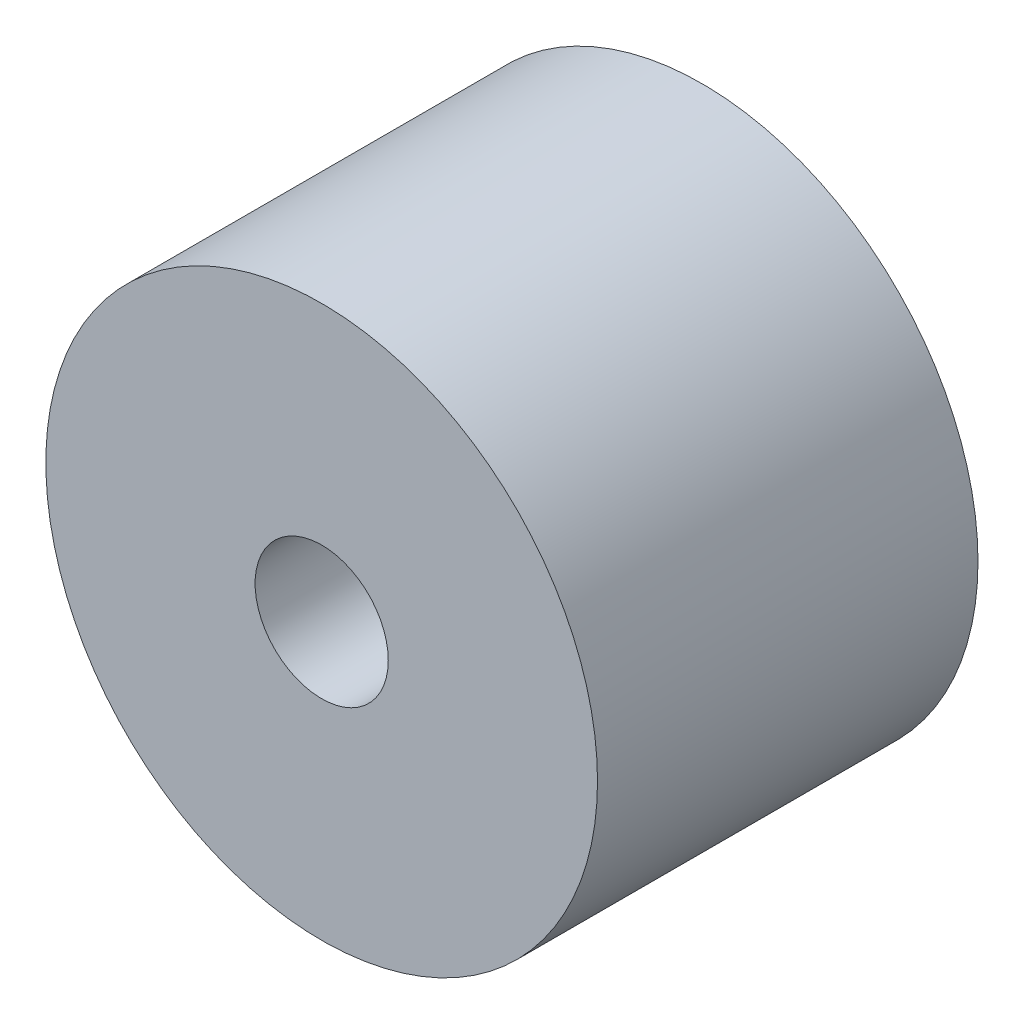
ISO-10303-21;
HEADER;
FILE_DESCRIPTION(('STEP AP214'),'2;1');
FILE_NAME('part.step','',(''),(''),'','','');
FILE_SCHEMA(('AUTOMOTIVE_DESIGN { 1 0 10303 214 1 1 1 1 }'));
ENDSEC;
DATA;
#1=APPLICATION_CONTEXT('core data for automotive mechanical design processes');
#2=APPLICATION_PROTOCOL_DEFINITION('international standard','automotive_design',2000,#1);
#3=PRODUCT_CONTEXT('',#1,'mechanical');
#4=PRODUCT('Part','Part','',(#3));
#5=PRODUCT_RELATED_PRODUCT_CATEGORY('part','',(#4));
#6=PRODUCT_DEFINITION_FORMATION('','',#4);
#7=PRODUCT_DEFINITION_CONTEXT('part definition',#1,'design');
#8=PRODUCT_DEFINITION('design','',#6,#7);
#9=PRODUCT_DEFINITION_SHAPE('','',#8);
#10=(LENGTH_UNIT() NAMED_UNIT(*) SI_UNIT(.MILLI.,.METRE.));
#11=(NAMED_UNIT(*) PLANE_ANGLE_UNIT() SI_UNIT($,.RADIAN.));
#12=(NAMED_UNIT(*) SI_UNIT($,.STERADIAN.) SOLID_ANGLE_UNIT());
#13=UNCERTAINTY_MEASURE_WITH_UNIT(LENGTH_MEASURE(1.E-05),#10,'distance_accuracy_value','');
#14=(GEOMETRIC_REPRESENTATION_CONTEXT(3) GLOBAL_UNCERTAINTY_ASSIGNED_CONTEXT((#13)) GLOBAL_UNIT_ASSIGNED_CONTEXT((#10,
#11,#12)) REPRESENTATION_CONTEXT('',''));
#15=CARTESIAN_POINT('',(0.,0.,0.));
#16=DIRECTION('',(0.,0.,1.));
#17=DIRECTION('',(1.,0.,0.));
#18=AXIS2_PLACEMENT_3D('',#15,#16,#17);
#19=CARTESIAN_POINT('',(0.,0.,20.));
#20=DIRECTION('',(0.,0.,1.));
#21=DIRECTION('',(1.,0.,0.));
#22=AXIS2_PLACEMENT_3D('',#19,#20,#21);
#23=PLANE('',#22);
#24=CARTESIAN_POINT('',(0.,0.,20.));
#25=DIRECTION('',(0.,0.,1.));
#26=DIRECTION('',(1.,0.,0.));
#27=AXIS2_PLACEMENT_3D('',#24,#25,#26);
#28=CIRCLE('',#27,14.5);
#29=CARTESIAN_POINT('',(14.5,0.,20.));
#30=VERTEX_POINT('',#29);
#31=EDGE_CURVE('E10',#30,#30,#28,.T.);
#32=ORIENTED_EDGE('',*,*,#31,.T.);
#33=EDGE_LOOP('',(#32));
#34=FACE_BOUND('',#33,.T.);
#35=CARTESIAN_POINT('',(0.,0.,20.));
#36=DIRECTION('',(0.,0.,1.));
#37=DIRECTION('',(1.,0.,0.));
#38=AXIS2_PLACEMENT_3D('',#35,#36,#37);
#39=CIRCLE('',#38,3.5);
#40=CARTESIAN_POINT('',(3.5,0.,20.));
#41=VERTEX_POINT('',#40);
#42=EDGE_CURVE('E50',#41,#41,#39,.T.);
#43=ORIENTED_EDGE('',*,*,#42,.F.);
#44=EDGE_LOOP('',(#43));
#45=FACE_BOUND('',#44,.T.);
#46=ADVANCED_FACE('F37',(#34,#45),#23,.T.);
#47=CARTESIAN_POINT('',(0.,0.,0.));
#48=DIRECTION('',(0.,0.,1.));
#49=DIRECTION('',(1.,0.,0.));
#50=AXIS2_PLACEMENT_3D('',#47,#48,#49);
#51=PLANE('',#50);
#52=CARTESIAN_POINT('',(0.,0.,0.));
#53=DIRECTION('',(0.,0.,1.));
#54=DIRECTION('',(1.,0.,0.));
#55=AXIS2_PLACEMENT_3D('',#52,#53,#54);
#56=CIRCLE('',#55,14.5);
#57=CARTESIAN_POINT('',(14.5,0.,0.));
#58=VERTEX_POINT('',#57);
#59=EDGE_CURVE('E41',#58,#58,#56,.T.);
#60=ORIENTED_EDGE('',*,*,#59,.F.);
#61=EDGE_LOOP('',(#60));
#62=FACE_BOUND('',#61,.T.);
#63=CARTESIAN_POINT('',(0.,0.,0.));
#64=DIRECTION('',(0.,0.,1.));
#65=DIRECTION('',(1.,0.,0.));
#66=AXIS2_PLACEMENT_3D('',#63,#64,#65);
#67=CIRCLE('',#66,3.5);
#68=CARTESIAN_POINT('',(3.5,0.,0.));
#69=VERTEX_POINT('',#68);
#70=EDGE_CURVE('E52',#69,#69,#67,.T.);
#71=ORIENTED_EDGE('',*,*,#70,.T.);
#72=EDGE_LOOP('',(#71));
#73=FACE_BOUND('',#72,.T.);
#74=ADVANCED_FACE('F64',(#62,#73),#51,.F.);
#75=CARTESIAN_POINT('',(0.,0.,20.));
#76=DIRECTION('',(0.,0.,-1.));
#77=DIRECTION('',(-1.,0.,0.));
#78=AXIS2_PLACEMENT_3D('',#75,#76,#77);
#79=CYLINDRICAL_SURFACE('',#78,14.5);
#80=ORIENTED_EDGE('',*,*,#31,.F.);
#81=EDGE_LOOP('',(#80));
#82=FACE_BOUND('',#81,.T.);
#83=ORIENTED_EDGE('',*,*,#59,.T.);
#84=EDGE_LOOP('',(#83));
#85=FACE_BOUND('',#84,.T.);
#86=ADVANCED_FACE('F39',(#82,#85),#79,.T.);
#87=CARTESIAN_POINT('',(0.,0.,20.));
#88=DIRECTION('',(0.,0.,-1.));
#89=DIRECTION('',(-1.,0.,0.));
#90=AXIS2_PLACEMENT_3D('',#87,#88,#89);
#91=CYLINDRICAL_SURFACE('',#90,3.5);
#92=ORIENTED_EDGE('',*,*,#42,.T.);
#93=EDGE_LOOP('',(#92));
#94=FACE_BOUND('',#93,.T.);
#95=ORIENTED_EDGE('',*,*,#70,.F.);
#96=EDGE_LOOP('',(#95));
#97=FACE_BOUND('',#96,.T.);
#98=ADVANCED_FACE('F60',(#94,#97),#91,.F.);
#99=CLOSED_SHELL('',(#46,#74,#86,#98));
#100=MANIFOLD_SOLID_BREP('B2',#99);
#101=ADVANCED_BREP_SHAPE_REPRESENTATION('',(#18,#100),#14);
#102=SHAPE_DEFINITION_REPRESENTATION(#9,#101);
ENDSEC;
END-ISO-10303-21;
